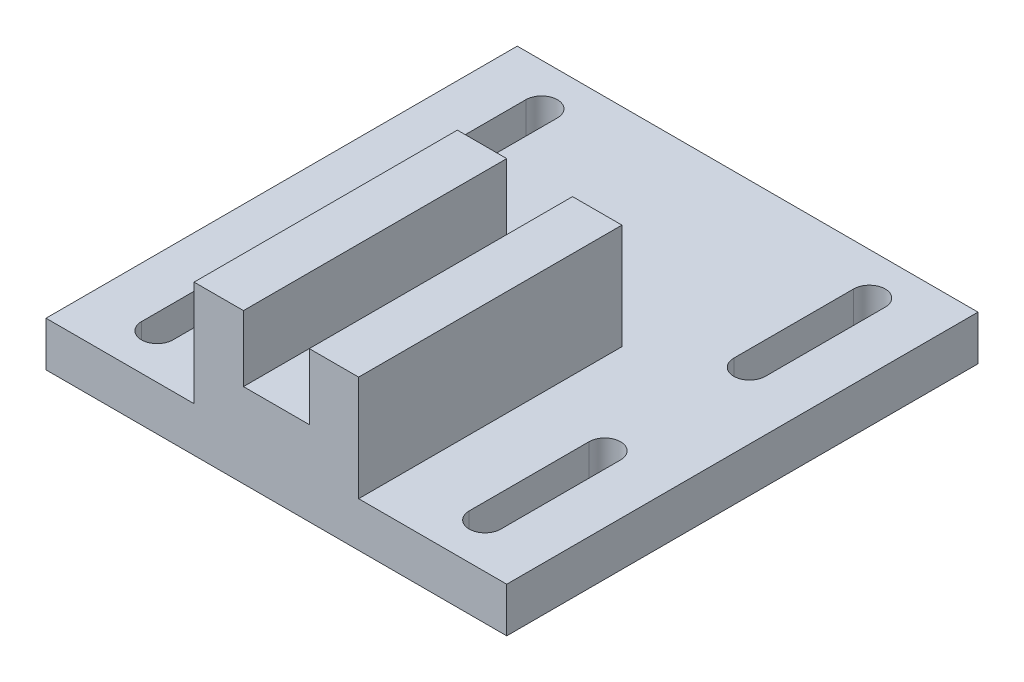
ISO-10303-21;
HEADER;
FILE_DESCRIPTION(('STEP AP214'),'2;1');
FILE_NAME('part.step','',(''),(''),'','','');
FILE_SCHEMA(('AUTOMOTIVE_DESIGN { 1 0 10303 214 1 1 1 1 }'));
ENDSEC;
DATA;
#1=APPLICATION_CONTEXT('core data for automotive mechanical design processes');
#2=APPLICATION_PROTOCOL_DEFINITION('international standard','automotive_design',2000,#1);
#3=PRODUCT_CONTEXT('',#1,'mechanical');
#4=PRODUCT('Part','Part','',(#3));
#5=PRODUCT_RELATED_PRODUCT_CATEGORY('part','',(#4));
#6=PRODUCT_DEFINITION_FORMATION('','',#4);
#7=PRODUCT_DEFINITION_CONTEXT('part definition',#1,'design');
#8=PRODUCT_DEFINITION('design','',#6,#7);
#9=PRODUCT_DEFINITION_SHAPE('','',#8);
#10=(LENGTH_UNIT() NAMED_UNIT(*) SI_UNIT(.MILLI.,.METRE.));
#11=(NAMED_UNIT(*) PLANE_ANGLE_UNIT() SI_UNIT($,.RADIAN.));
#12=(NAMED_UNIT(*) SI_UNIT($,.STERADIAN.) SOLID_ANGLE_UNIT());
#13=UNCERTAINTY_MEASURE_WITH_UNIT(LENGTH_MEASURE(1.E-05),#10,'distance_accuracy_value','');
#14=(GEOMETRIC_REPRESENTATION_CONTEXT(3) GLOBAL_UNCERTAINTY_ASSIGNED_CONTEXT((#13)) GLOBAL_UNIT_ASSIGNED_CONTEXT((#10,
#11,#12)) REPRESENTATION_CONTEXT('',''));
#15=CARTESIAN_POINT('',(0.,0.,0.));
#16=DIRECTION('',(0.,0.,1.));
#17=DIRECTION('',(1.,0.,0.));
#18=AXIS2_PLACEMENT_3D('',#15,#16,#17);
#19=CARTESIAN_POINT('',(0.,14.478,0.));
#20=DIRECTION('',(0.,1.,0.));
#21=DIRECTION('',(0.,0.,1.));
#22=AXIS2_PLACEMENT_3D('',#19,#20,#21);
#23=PLANE('',#22);
#24=DIRECTION('',(0.,0.,-1.));
#25=VECTOR('',#24,1.);
#26=CARTESIAN_POINT('',(25.4,14.478,0.));
#27=LINE('',#26,#25);
#28=CARTESIAN_POINT('',(25.4,14.478,45.466));
#29=VERTEX_POINT('',#28);
#30=CARTESIAN_POINT('',(25.4,14.478,20.066));
#31=VERTEX_POINT('',#30);
#32=EDGE_CURVE('E47',#29,#31,#27,.T.);
#33=ORIENTED_EDGE('',*,*,#32,.F.);
#34=DIRECTION('',(-1.,0.,0.));
#35=VECTOR('',#34,1.);
#36=CARTESIAN_POINT('',(0.,14.478,45.466));
#37=LINE('',#36,#35);
#38=CARTESIAN_POINT('',(30.1625,14.478,45.466));
#39=VERTEX_POINT('',#38);
#40=EDGE_CURVE('E258',#39,#29,#37,.T.);
#41=ORIENTED_EDGE('',*,*,#40,.F.);
#42=DIRECTION('',(0.,0.,1.));
#43=VECTOR('',#42,1.);
#44=CARTESIAN_POINT('',(30.1625,14.478,0.));
#45=LINE('',#44,#43);
#46=CARTESIAN_POINT('',(30.1625,14.478,20.066));
#47=VERTEX_POINT('',#46);
#48=EDGE_CURVE('E261',#47,#39,#45,.T.);
#49=ORIENTED_EDGE('',*,*,#48,.F.);
#50=DIRECTION('',(-1.,0.,0.));
#51=VECTOR('',#50,1.);
#52=CARTESIAN_POINT('',(0.,14.478,20.066));
#53=LINE('',#52,#51);
#54=EDGE_CURVE('E251',#47,#31,#53,.T.);
#55=ORIENTED_EDGE('',*,*,#54,.T.);
#56=EDGE_LOOP('',(#33,#41,#49,#55));
#57=FACE_BOUND('',#56,.T.);
#58=ADVANCED_FACE('F39',(#57),#23,.T.);
#59=CARTESIAN_POINT('',(0.,4.318,0.));
#60=DIRECTION('',(0.,1.,0.));
#61=DIRECTION('',(0.,0.,1.));
#62=AXIS2_PLACEMENT_3D('',#59,#60,#61);
#63=PLANE('',#62);
#64=CARTESIAN_POINT('',(38.0365,4.318,41.148));
#65=DIRECTION('',(0.,1.,0.));
#66=DIRECTION('',(0.,0.,1.));
#67=AXIS2_PLACEMENT_3D('',#64,#65,#66);
#68=CIRCLE('',#67,1.524);
#69=CARTESIAN_POINT('',(36.5125,4.318,41.148));
#70=VERTEX_POINT('',#69);
#71=CARTESIAN_POINT('',(39.5605,4.318,41.148));
#72=VERTEX_POINT('',#71);
#73=EDGE_CURVE('E282',#70,#72,#68,.T.);
#74=ORIENTED_EDGE('',*,*,#73,.F.);
#75=DIRECTION('',(0.,0.,1.));
#76=VECTOR('',#75,1.);
#77=CARTESIAN_POINT('',(36.5125,4.318,0.));
#78=LINE('',#77,#76);
#79=CARTESIAN_POINT('',(36.5125,4.318,29.591));
#80=VERTEX_POINT('',#79);
#81=EDGE_CURVE('E285',#80,#70,#78,.T.);
#82=ORIENTED_EDGE('',*,*,#81,.F.);
#83=CARTESIAN_POINT('',(38.0365,4.318,29.591));
#84=DIRECTION('',(0.,1.,0.));
#85=DIRECTION('',(0.,0.,1.));
#86=AXIS2_PLACEMENT_3D('',#83,#84,#85);
#87=CIRCLE('',#86,1.524);
#88=CARTESIAN_POINT('',(39.5605,4.318,29.591));
#89=VERTEX_POINT('',#88);
#90=EDGE_CURVE('E289',#89,#80,#87,.T.);
#91=ORIENTED_EDGE('',*,*,#90,.F.);
#92=DIRECTION('',(0.,0.,1.));
#93=VECTOR('',#92,1.);
#94=CARTESIAN_POINT('',(39.5605,4.318,0.));
#95=LINE('',#94,#93);
#96=EDGE_CURVE('E292',#89,#72,#95,.T.);
#97=ORIENTED_EDGE('',*,*,#96,.T.);
#98=EDGE_LOOP('',(#74,#82,#91,#97));
#99=FACE_BOUND('',#98,.T.);
#100=CARTESIAN_POINT('',(38.0365,4.318,15.621));
#101=DIRECTION('',(0.,1.,0.));
#102=DIRECTION('',(0.,0.,1.));
#103=AXIS2_PLACEMENT_3D('',#100,#101,#102);
#104=CIRCLE('',#103,1.52400000000002);
#105=CARTESIAN_POINT('',(36.5125,4.318,15.621));
#106=VERTEX_POINT('',#105);
#107=CARTESIAN_POINT('',(39.5605,4.318,15.621));
#108=VERTEX_POINT('',#107);
#109=EDGE_CURVE('E294',#106,#108,#104,.T.);
#110=ORIENTED_EDGE('',*,*,#109,.F.);
#111=DIRECTION('',(0.,0.,1.));
#112=VECTOR('',#111,1.);
#113=CARTESIAN_POINT('',(36.5125,4.318,0.));
#114=LINE('',#113,#112);
#115=CARTESIAN_POINT('',(36.5125,4.318,4.064));
#116=VERTEX_POINT('',#115);
#117=EDGE_CURVE('E297',#116,#106,#114,.T.);
#118=ORIENTED_EDGE('',*,*,#117,.F.);
#119=CARTESIAN_POINT('',(38.0365,4.318,4.064));
#120=DIRECTION('',(0.,1.,0.));
#121=DIRECTION('',(0.,0.,1.));
#122=AXIS2_PLACEMENT_3D('',#119,#120,#121);
#123=CIRCLE('',#122,1.52400000000001);
#124=CARTESIAN_POINT('',(39.5605,4.318,4.064));
#125=VERTEX_POINT('',#124);
#126=EDGE_CURVE('E300',#125,#116,#123,.T.);
#127=ORIENTED_EDGE('',*,*,#126,.F.);
#128=DIRECTION('',(0.,0.,1.));
#129=VECTOR('',#128,1.);
#130=CARTESIAN_POINT('',(39.5605,4.318,0.));
#131=LINE('',#130,#129);
#132=EDGE_CURVE('E303',#125,#108,#131,.T.);
#133=ORIENTED_EDGE('',*,*,#132,.T.);
#134=EDGE_LOOP('',(#110,#118,#127,#133));
#135=FACE_BOUND('',#134,.T.);
#136=CARTESIAN_POINT('',(6.4135,4.318,41.148));
#137=DIRECTION('',(0.,1.,0.));
#138=DIRECTION('',(0.,0.,1.));
#139=AXIS2_PLACEMENT_3D('',#136,#137,#138);
#140=CIRCLE('',#139,1.524);
#141=CARTESIAN_POINT('',(4.88949999999999,4.318,41.148));
#142=VERTEX_POINT('',#141);
#143=CARTESIAN_POINT('',(7.9375,4.318,41.148));
#144=VERTEX_POINT('',#143);
#145=EDGE_CURVE('E305',#142,#144,#140,.T.);
#146=ORIENTED_EDGE('',*,*,#145,.F.);
#147=DIRECTION('',(0.,0.,1.));
#148=VECTOR('',#147,1.);
#149=CARTESIAN_POINT('',(4.88949999999999,4.318,0.));
#150=LINE('',#149,#148);
#151=CARTESIAN_POINT('',(4.88949999999999,4.318,29.591));
#152=VERTEX_POINT('',#151);
#153=EDGE_CURVE('E308',#152,#142,#150,.T.);
#154=ORIENTED_EDGE('',*,*,#153,.F.);
#155=CARTESIAN_POINT('',(6.4135,4.318,29.591));
#156=DIRECTION('',(0.,1.,0.));
#157=DIRECTION('',(0.,0.,1.));
#158=AXIS2_PLACEMENT_3D('',#155,#156,#157);
#159=CIRCLE('',#158,1.524);
#160=CARTESIAN_POINT('',(7.9375,4.318,29.591));
#161=VERTEX_POINT('',#160);
#162=EDGE_CURVE('E311',#161,#152,#159,.T.);
#163=ORIENTED_EDGE('',*,*,#162,.F.);
#164=DIRECTION('',(0.,0.,1.));
#165=VECTOR('',#164,1.);
#166=CARTESIAN_POINT('',(7.9375,4.318,0.));
#167=LINE('',#166,#165);
#168=EDGE_CURVE('E314',#161,#144,#167,.T.);
#169=ORIENTED_EDGE('',*,*,#168,.T.);
#170=EDGE_LOOP('',(#146,#154,#163,#169));
#171=FACE_BOUND('',#170,.T.);
#172=CARTESIAN_POINT('',(6.4135,4.318,15.621));
#173=DIRECTION('',(0.,1.,0.));
#174=DIRECTION('',(0.,0.,1.));
#175=AXIS2_PLACEMENT_3D('',#172,#173,#174);
#176=CIRCLE('',#175,1.52400000000002);
#177=CARTESIAN_POINT('',(4.88949999999998,4.318,15.621));
#178=VERTEX_POINT('',#177);
#179=CARTESIAN_POINT('',(7.93750000000002,4.318,15.621));
#180=VERTEX_POINT('',#179);
#181=EDGE_CURVE('E316',#178,#180,#176,.T.);
#182=ORIENTED_EDGE('',*,*,#181,.F.);
#183=DIRECTION('',(0.,0.,1.));
#184=VECTOR('',#183,1.);
#185=CARTESIAN_POINT('',(4.88949999999999,4.318,0.));
#186=LINE('',#185,#184);
#187=CARTESIAN_POINT('',(4.88949999999998,4.318,4.064));
#188=VERTEX_POINT('',#187);
#189=EDGE_CURVE('E319',#188,#178,#186,.T.);
#190=ORIENTED_EDGE('',*,*,#189,.F.);
#191=CARTESIAN_POINT('',(6.4135,4.318,4.064));
#192=DIRECTION('',(0.,1.,0.));
#193=DIRECTION('',(0.,0.,1.));
#194=AXIS2_PLACEMENT_3D('',#191,#192,#193);
#195=CIRCLE('',#194,1.52400000000001);
#196=CARTESIAN_POINT('',(7.93750000000001,4.318,4.064));
#197=VERTEX_POINT('',#196);
#198=EDGE_CURVE('E322',#197,#188,#195,.T.);
#199=ORIENTED_EDGE('',*,*,#198,.F.);
#200=DIRECTION('',(0.,0.,1.));
#201=VECTOR('',#200,1.);
#202=CARTESIAN_POINT('',(7.9375,4.318,0.));
#203=LINE('',#202,#201);
#204=EDGE_CURVE('E325',#197,#180,#203,.T.);
#205=ORIENTED_EDGE('',*,*,#204,.T.);
#206=EDGE_LOOP('',(#182,#190,#199,#205));
#207=FACE_BOUND('',#206,.T.);
#208=DIRECTION('',(-1.,0.,0.));
#209=VECTOR('',#208,1.);
#210=CARTESIAN_POINT('',(0.,4.318,20.066));
#211=LINE('',#210,#209);
#212=CARTESIAN_POINT('',(30.1625,4.318,20.066));
#213=VERTEX_POINT('',#212);
#214=CARTESIAN_POINT('',(14.2875,4.318,20.066));
#215=VERTEX_POINT('',#214);
#216=EDGE_CURVE('E62',#213,#215,#211,.T.);
#217=ORIENTED_EDGE('',*,*,#216,.F.);
#218=DIRECTION('',(0.,0.,1.));
#219=VECTOR('',#218,1.);
#220=CARTESIAN_POINT('',(30.1625,4.318,0.));
#221=LINE('',#220,#219);
#222=CARTESIAN_POINT('',(30.1625,4.318,45.466));
#223=VERTEX_POINT('',#222);
#224=EDGE_CURVE('E269',#213,#223,#221,.T.);
#225=ORIENTED_EDGE('',*,*,#224,.T.);
#226=DIRECTION('',(1.,0.,0.));
#227=VECTOR('',#226,1.);
#228=CARTESIAN_POINT('',(0.,4.318,45.466));
#229=LINE('',#228,#227);
#230=CARTESIAN_POINT('',(44.45,4.318,45.466));
#231=VERTEX_POINT('',#230);
#232=EDGE_CURVE('E330',#223,#231,#229,.T.);
#233=ORIENTED_EDGE('',*,*,#232,.T.);
#234=DIRECTION('',(0.,0.,1.));
#235=VECTOR('',#234,1.);
#236=CARTESIAN_POINT('',(44.45,4.318,0.));
#237=LINE('',#236,#235);
#238=CARTESIAN_POINT('',(44.45,4.318,0.));
#239=VERTEX_POINT('',#238);
#240=EDGE_CURVE('E333',#239,#231,#237,.T.);
#241=ORIENTED_EDGE('',*,*,#240,.F.);
#242=DIRECTION('',(1.,0.,0.));
#243=VECTOR('',#242,1.);
#244=CARTESIAN_POINT('',(0.,4.318,0.));
#245=LINE('',#244,#243);
#246=CARTESIAN_POINT('',(0.,4.318,0.));
#247=VERTEX_POINT('',#246);
#248=EDGE_CURVE('E336',#247,#239,#245,.T.);
#249=ORIENTED_EDGE('',*,*,#248,.F.);
#250=DIRECTION('',(0.,0.,1.));
#251=VECTOR('',#250,1.);
#252=CARTESIAN_POINT('',(0.,4.318,0.));
#253=LINE('',#252,#251);
#254=CARTESIAN_POINT('',(0.,4.318,45.466));
#255=VERTEX_POINT('',#254);
#256=EDGE_CURVE('E327',#247,#255,#253,.T.);
#257=ORIENTED_EDGE('',*,*,#256,.T.);
#258=CARTESIAN_POINT('',(14.2875,4.318,45.466));
#259=VERTEX_POINT('',#258);
#260=EDGE_CURVE('E331',#255,#259,#229,.T.);
#261=ORIENTED_EDGE('',*,*,#260,.T.);
#262=DIRECTION('',(0.,0.,1.));
#263=VECTOR('',#262,1.);
#264=CARTESIAN_POINT('',(14.2875,4.318,0.));
#265=LINE('',#264,#263);
#266=EDGE_CURVE('E266',#215,#259,#265,.T.);
#267=ORIENTED_EDGE('',*,*,#266,.F.);
#268=EDGE_LOOP('',(#217,#225,#233,#241,#249,#257,#261,#267));
#269=FACE_BOUND('',#268,.T.);
#270=ADVANCED_FACE('F461',(#99,#135,#171,#207,#269),#63,.T.);
#271=CARTESIAN_POINT('',(0.,4.318,0.));
#272=DIRECTION('',(1.,0.,0.));
#273=DIRECTION('',(0.,0.,-1.));
#274=AXIS2_PLACEMENT_3D('',#271,#272,#273);
#275=PLANE('',#274);
#276=DIRECTION('',(0.,0.,1.));
#277=VECTOR('',#276,1.);
#278=CARTESIAN_POINT('',(0.,0.,0.));
#279=LINE('',#278,#277);
#280=CARTESIAN_POINT('',(0.,0.,0.));
#281=VERTEX_POINT('',#280);
#282=CARTESIAN_POINT('',(0.,0.,45.466));
#283=VERTEX_POINT('',#282);
#284=EDGE_CURVE('E387',#281,#283,#279,.T.);
#285=ORIENTED_EDGE('',*,*,#284,.T.);
#286=DIRECTION('',(0.,-1.,0.));
#287=VECTOR('',#286,1.);
#288=CARTESIAN_POINT('',(0.,4.318,45.466));
#289=LINE('',#288,#287);
#290=EDGE_CURVE('E405',#255,#283,#289,.T.);
#291=ORIENTED_EDGE('',*,*,#290,.F.);
#292=ORIENTED_EDGE('',*,*,#256,.F.);
#293=DIRECTION('',(0.,-1.,0.));
#294=VECTOR('',#293,1.);
#295=CARTESIAN_POINT('',(0.,4.318,0.));
#296=LINE('',#295,#294);
#297=EDGE_CURVE('E398',#247,#281,#296,.T.);
#298=ORIENTED_EDGE('',*,*,#297,.T.);
#299=EDGE_LOOP('',(#285,#291,#292,#298));
#300=FACE_BOUND('',#299,.T.);
#301=ADVANCED_FACE('F472',(#300),#275,.F.);
#302=CARTESIAN_POINT('',(0.,4.318,45.466));
#303=DIRECTION('',(0.,0.,-1.));
#304=DIRECTION('',(-1.,0.,0.));
#305=AXIS2_PLACEMENT_3D('',#302,#303,#304);
#306=PLANE('',#305);
#307=ORIENTED_EDGE('',*,*,#40,.T.);
#308=DIRECTION('',(0.,-1.,0.));
#309=VECTOR('',#308,1.);
#310=CARTESIAN_POINT('',(25.4,4.318,45.466));
#311=LINE('',#310,#309);
#312=CARTESIAN_POINT('',(25.4,8.128,45.466));
#313=VERTEX_POINT('',#312);
#314=EDGE_CURVE('E246',#29,#313,#311,.T.);
#315=ORIENTED_EDGE('',*,*,#314,.T.);
#316=DIRECTION('',(-1.,0.,0.));
#317=VECTOR('',#316,1.);
#318=CARTESIAN_POINT('',(0.,8.128,45.466));
#319=LINE('',#318,#317);
#320=CARTESIAN_POINT('',(19.05,8.128,45.466));
#321=VERTEX_POINT('',#320);
#322=EDGE_CURVE('E249',#313,#321,#319,.T.);
#323=ORIENTED_EDGE('',*,*,#322,.T.);
#324=DIRECTION('',(0.,1.,0.));
#325=VECTOR('',#324,1.);
#326=CARTESIAN_POINT('',(19.05,4.318,45.466));
#327=LINE('',#326,#325);
#328=CARTESIAN_POINT('',(19.05,14.478,45.466));
#329=VERTEX_POINT('',#328);
#330=EDGE_CURVE('E234',#321,#329,#327,.T.);
#331=ORIENTED_EDGE('',*,*,#330,.T.);
#332=CARTESIAN_POINT('',(14.2875,14.478,45.466));
#333=VERTEX_POINT('',#332);
#334=EDGE_CURVE('E257',#329,#333,#37,.T.);
#335=ORIENTED_EDGE('',*,*,#334,.T.);
#336=DIRECTION('',(0.,-1.,0.));
#337=VECTOR('',#336,1.);
#338=CARTESIAN_POINT('',(14.2875,14.478,45.466));
#339=LINE('',#338,#337);
#340=EDGE_CURVE('E275',#333,#259,#339,.T.);
#341=ORIENTED_EDGE('',*,*,#340,.T.);
#342=ORIENTED_EDGE('',*,*,#260,.F.);
#343=ORIENTED_EDGE('',*,*,#290,.T.);
#344=DIRECTION('',(1.,0.,0.));
#345=VECTOR('',#344,1.);
#346=CARTESIAN_POINT('',(0.,0.,45.466));
#347=LINE('',#346,#345);
#348=CARTESIAN_POINT('',(44.45,0.,45.466));
#349=VERTEX_POINT('',#348);
#350=EDGE_CURVE('E390',#283,#349,#347,.T.);
#351=ORIENTED_EDGE('',*,*,#350,.T.);
#352=DIRECTION('',(0.,-1.,0.));
#353=VECTOR('',#352,1.);
#354=CARTESIAN_POINT('',(44.45,4.318,45.466));
#355=LINE('',#354,#353);
#356=EDGE_CURVE('E403',#231,#349,#355,.T.);
#357=ORIENTED_EDGE('',*,*,#356,.F.);
#358=ORIENTED_EDGE('',*,*,#232,.F.);
#359=DIRECTION('',(0.,-1.,0.));
#360=VECTOR('',#359,1.);
#361=CARTESIAN_POINT('',(30.1625,14.478,45.466));
#362=LINE('',#361,#360);
#363=EDGE_CURVE('E272',#39,#223,#362,.T.);
#364=ORIENTED_EDGE('',*,*,#363,.F.);
#365=EDGE_LOOP('',(#307,#315,#323,#331,#335,#341,#342,#343,#351,#357,#358,#364));
#366=FACE_BOUND('',#365,.T.);
#367=ADVANCED_FACE('F457',(#366),#306,.F.);
#368=CARTESIAN_POINT('',(44.45,4.318,0.));
#369=DIRECTION('',(1.,0.,0.));
#370=DIRECTION('',(0.,0.,-1.));
#371=AXIS2_PLACEMENT_3D('',#368,#369,#370);
#372=PLANE('',#371);
#373=DIRECTION('',(0.,0.,1.));
#374=VECTOR('',#373,1.);
#375=CARTESIAN_POINT('',(44.45,0.,0.));
#376=LINE('',#375,#374);
#377=CARTESIAN_POINT('',(44.45,0.,0.));
#378=VERTEX_POINT('',#377);
#379=EDGE_CURVE('E393',#378,#349,#376,.T.);
#380=ORIENTED_EDGE('',*,*,#379,.F.);
#381=DIRECTION('',(0.,-1.,0.));
#382=VECTOR('',#381,1.);
#383=CARTESIAN_POINT('',(44.45,4.318,0.));
#384=LINE('',#383,#382);
#385=EDGE_CURVE('E400',#239,#378,#384,.T.);
#386=ORIENTED_EDGE('',*,*,#385,.F.);
#387=ORIENTED_EDGE('',*,*,#240,.T.);
#388=ORIENTED_EDGE('',*,*,#356,.T.);
#389=EDGE_LOOP('',(#380,#386,#387,#388));
#390=FACE_BOUND('',#389,.T.);
#391=ADVANCED_FACE('F475',(#390),#372,.T.);
#392=CARTESIAN_POINT('',(6.4135,4.318,15.621));
#393=DIRECTION('',(0.,-1.,0.));
#394=DIRECTION('',(0.,0.,-1.));
#395=AXIS2_PLACEMENT_3D('',#392,#393,#394);
#396=CYLINDRICAL_SURFACE('',#395,1.52400000000002);
#397=CARTESIAN_POINT('',(6.4135,0.,15.621));
#398=DIRECTION('',(0.,1.,0.));
#399=DIRECTION('',(0.,0.,1.));
#400=AXIS2_PLACEMENT_3D('',#397,#398,#399);
#401=CIRCLE('',#400,1.52400000000002);
#402=CARTESIAN_POINT('',(4.88949999999998,0.,15.621));
#403=VERTEX_POINT('',#402);
#404=CARTESIAN_POINT('',(7.93750000000002,0.,15.621));
#405=VERTEX_POINT('',#404);
#406=EDGE_CURVE('E375',#403,#405,#401,.T.);
#407=ORIENTED_EDGE('',*,*,#406,.F.);
#408=DIRECTION('',(0.,-1.,0.));
#409=VECTOR('',#408,1.);
#410=CARTESIAN_POINT('',(4.88949999999998,4.318,15.621));
#411=LINE('',#410,#409);
#412=EDGE_CURVE('E401',#178,#403,#411,.T.);
#413=ORIENTED_EDGE('',*,*,#412,.F.);
#414=ORIENTED_EDGE('',*,*,#181,.T.);
#415=DIRECTION('',(0.,-1.,0.));
#416=VECTOR('',#415,1.);
#417=CARTESIAN_POINT('',(7.93750000000002,4.318,15.621));
#418=LINE('',#417,#416);
#419=EDGE_CURVE('E409',#180,#405,#418,.T.);
#420=ORIENTED_EDGE('',*,*,#419,.T.);
#421=EDGE_LOOP('',(#407,#413,#414,#420));
#422=FACE_BOUND('',#421,.T.);
#423=ADVANCED_FACE('F477',(#422),#396,.F.);
#424=CARTESIAN_POINT('',(4.88949999999999,4.318,0.));
#425=DIRECTION('',(1.,0.,0.));
#426=DIRECTION('',(0.,0.,-1.));
#427=AXIS2_PLACEMENT_3D('',#424,#425,#426);
#428=PLANE('',#427);
#429=DIRECTION('',(0.,0.,1.));
#430=VECTOR('',#429,1.);
#431=CARTESIAN_POINT('',(4.88949999999999,0.,0.));
#432=LINE('',#431,#430);
#433=CARTESIAN_POINT('',(4.88949999999998,0.,4.064));
#434=VERTEX_POINT('',#433);
#435=EDGE_CURVE('E378',#434,#403,#432,.T.);
#436=ORIENTED_EDGE('',*,*,#435,.F.);
#437=DIRECTION('',(0.,-1.,0.));
#438=VECTOR('',#437,1.);
#439=CARTESIAN_POINT('',(4.88949999999998,4.318,4.064));
#440=LINE('',#439,#438);
#441=EDGE_CURVE('E414',#188,#434,#440,.T.);
#442=ORIENTED_EDGE('',*,*,#441,.F.);
#443=ORIENTED_EDGE('',*,*,#189,.T.);
#444=ORIENTED_EDGE('',*,*,#412,.T.);
#445=EDGE_LOOP('',(#436,#442,#443,#444));
#446=FACE_BOUND('',#445,.T.);
#447=ADVANCED_FACE('F483',(#446),#428,.T.);
#448=CARTESIAN_POINT('',(6.4135,4.318,4.064));
#449=DIRECTION('',(0.,-1.,0.));
#450=DIRECTION('',(0.,0.,-1.));
#451=AXIS2_PLACEMENT_3D('',#448,#449,#450);
#452=CYLINDRICAL_SURFACE('',#451,1.52400000000001);
#453=CARTESIAN_POINT('',(6.4135,0.,4.064));
#454=DIRECTION('',(0.,1.,0.));
#455=DIRECTION('',(0.,0.,1.));
#456=AXIS2_PLACEMENT_3D('',#453,#454,#455);
#457=CIRCLE('',#456,1.52400000000001);
#458=CARTESIAN_POINT('',(7.93750000000001,0.,4.064));
#459=VERTEX_POINT('',#458);
#460=EDGE_CURVE('E381',#459,#434,#457,.T.);
#461=ORIENTED_EDGE('',*,*,#460,.F.);
#462=DIRECTION('',(0.,-1.,0.));
#463=VECTOR('',#462,1.);
#464=CARTESIAN_POINT('',(7.93750000000001,4.318,4.064));
#465=LINE('',#464,#463);
#466=EDGE_CURVE('E411',#197,#459,#465,.T.);
#467=ORIENTED_EDGE('',*,*,#466,.F.);
#468=ORIENTED_EDGE('',*,*,#198,.T.);
#469=ORIENTED_EDGE('',*,*,#441,.T.);
#470=EDGE_LOOP('',(#461,#467,#468,#469));
#471=FACE_BOUND('',#470,.T.);
#472=ADVANCED_FACE('F569',(#471),#452,.F.);
#473=CARTESIAN_POINT('',(6.4135,4.318,41.148));
#474=DIRECTION('',(0.,-1.,0.));
#475=DIRECTION('',(0.,0.,-1.));
#476=AXIS2_PLACEMENT_3D('',#473,#474,#475);
#477=CYLINDRICAL_SURFACE('',#476,1.524);
#478=CARTESIAN_POINT('',(6.4135,0.,41.148));
#479=DIRECTION('',(0.,1.,0.));
#480=DIRECTION('',(0.,0.,1.));
#481=AXIS2_PLACEMENT_3D('',#478,#479,#480);
#482=CIRCLE('',#481,1.524);
#483=CARTESIAN_POINT('',(4.88949999999999,0.,41.148));
#484=VERTEX_POINT('',#483);
#485=CARTESIAN_POINT('',(7.9375,0.,41.148));
#486=VERTEX_POINT('',#485);
#487=EDGE_CURVE('E363',#484,#486,#482,.T.);
#488=ORIENTED_EDGE('',*,*,#487,.F.);
#489=DIRECTION('',(0.,-1.,0.));
#490=VECTOR('',#489,1.);
#491=CARTESIAN_POINT('',(4.88949999999999,4.318,41.148));
#492=LINE('',#491,#490);
#493=EDGE_CURVE('E412',#142,#484,#492,.T.);
#494=ORIENTED_EDGE('',*,*,#493,.F.);
#495=ORIENTED_EDGE('',*,*,#145,.T.);
#496=DIRECTION('',(0.,-1.,0.));
#497=VECTOR('',#496,1.);
#498=CARTESIAN_POINT('',(7.9375,4.318,41.148));
#499=LINE('',#498,#497);
#500=EDGE_CURVE('E417',#144,#486,#499,.T.);
#501=ORIENTED_EDGE('',*,*,#500,.T.);
#502=EDGE_LOOP('',(#488,#494,#495,#501));
#503=FACE_BOUND('',#502,.T.);
#504=ADVANCED_FACE('F584',(#503),#477,.F.);
#505=CARTESIAN_POINT('',(4.88949999999999,4.318,0.));
#506=DIRECTION('',(1.,0.,0.));
#507=DIRECTION('',(0.,0.,-1.));
#508=AXIS2_PLACEMENT_3D('',#505,#506,#507);
#509=PLANE('',#508);
#510=DIRECTION('',(0.,0.,1.));
#511=VECTOR('',#510,1.);
#512=CARTESIAN_POINT('',(4.88949999999999,0.,0.));
#513=LINE('',#512,#511);
#514=CARTESIAN_POINT('',(4.88949999999999,0.,29.591));
#515=VERTEX_POINT('',#514);
#516=EDGE_CURVE('E366',#515,#484,#513,.T.);
#517=ORIENTED_EDGE('',*,*,#516,.F.);
#518=DIRECTION('',(0.,-1.,0.));
#519=VECTOR('',#518,1.);
#520=CARTESIAN_POINT('',(4.88949999999999,4.318,29.591));
#521=LINE('',#520,#519);
#522=EDGE_CURVE('E422',#152,#515,#521,.T.);
#523=ORIENTED_EDGE('',*,*,#522,.F.);
#524=ORIENTED_EDGE('',*,*,#153,.T.);
#525=ORIENTED_EDGE('',*,*,#493,.T.);
#526=EDGE_LOOP('',(#517,#523,#524,#525));
#527=FACE_BOUND('',#526,.T.);
#528=ADVANCED_FACE('F590',(#527),#509,.T.);
#529=CARTESIAN_POINT('',(6.4135,4.318,29.591));
#530=DIRECTION('',(0.,-1.,0.));
#531=DIRECTION('',(0.,0.,-1.));
#532=AXIS2_PLACEMENT_3D('',#529,#530,#531);
#533=CYLINDRICAL_SURFACE('',#532,1.524);
#534=CARTESIAN_POINT('',(6.4135,0.,29.591));
#535=DIRECTION('',(0.,1.,0.));
#536=DIRECTION('',(0.,0.,1.));
#537=AXIS2_PLACEMENT_3D('',#534,#535,#536);
#538=CIRCLE('',#537,1.524);
#539=CARTESIAN_POINT('',(7.9375,0.,29.591));
#540=VERTEX_POINT('',#539);
#541=EDGE_CURVE('E369',#540,#515,#538,.T.);
#542=ORIENTED_EDGE('',*,*,#541,.F.);
#543=DIRECTION('',(0.,-1.,0.));
#544=VECTOR('',#543,1.);
#545=CARTESIAN_POINT('',(7.9375,4.318,29.591));
#546=LINE('',#545,#544);
#547=EDGE_CURVE('E419',#161,#540,#546,.T.);
#548=ORIENTED_EDGE('',*,*,#547,.F.);
#549=ORIENTED_EDGE('',*,*,#162,.T.);
#550=ORIENTED_EDGE('',*,*,#522,.T.);
#551=EDGE_LOOP('',(#542,#548,#549,#550));
#552=FACE_BOUND('',#551,.T.);
#553=ADVANCED_FACE('F587',(#552),#533,.F.);
#554=CARTESIAN_POINT('',(38.0365,4.318,15.621));
#555=DIRECTION('',(0.,-1.,0.));
#556=DIRECTION('',(0.,0.,-1.));
#557=AXIS2_PLACEMENT_3D('',#554,#555,#556);
#558=CYLINDRICAL_SURFACE('',#557,1.52400000000002);
#559=CARTESIAN_POINT('',(38.0365,0.,15.621));
#560=DIRECTION('',(0.,1.,0.));
#561=DIRECTION('',(0.,0.,1.));
#562=AXIS2_PLACEMENT_3D('',#559,#560,#561);
#563=CIRCLE('',#562,1.52400000000002);
#564=CARTESIAN_POINT('',(36.5125,0.,15.621));
#565=VERTEX_POINT('',#564);
#566=CARTESIAN_POINT('',(39.5605,0.,15.621));
#567=VERTEX_POINT('',#566);
#568=EDGE_CURVE('E351',#565,#567,#563,.T.);
#569=ORIENTED_EDGE('',*,*,#568,.F.);
#570=DIRECTION('',(0.,-1.,0.));
#571=VECTOR('',#570,1.);
#572=CARTESIAN_POINT('',(36.5125,4.318,15.621));
#573=LINE('',#572,#571);
#574=EDGE_CURVE('E420',#106,#565,#573,.T.);
#575=ORIENTED_EDGE('',*,*,#574,.F.);
#576=ORIENTED_EDGE('',*,*,#109,.T.);
#577=DIRECTION('',(0.,-1.,0.));
#578=VECTOR('',#577,1.);
#579=CARTESIAN_POINT('',(39.5605,4.318,15.621));
#580=LINE('',#579,#578);
#581=EDGE_CURVE('E425',#108,#567,#580,.T.);
#582=ORIENTED_EDGE('',*,*,#581,.T.);
#583=EDGE_LOOP('',(#569,#575,#576,#582));
#584=FACE_BOUND('',#583,.T.);
#585=ADVANCED_FACE('F528',(#584),#558,.F.);
#586=CARTESIAN_POINT('',(36.5125,4.318,0.));
#587=DIRECTION('',(1.,0.,0.));
#588=DIRECTION('',(0.,0.,-1.));
#589=AXIS2_PLACEMENT_3D('',#586,#587,#588);
#590=PLANE('',#589);
#591=DIRECTION('',(0.,0.,1.));
#592=VECTOR('',#591,1.);
#593=CARTESIAN_POINT('',(36.5125,0.,0.));
#594=LINE('',#593,#592);
#595=CARTESIAN_POINT('',(36.5125,0.,4.064));
#596=VERTEX_POINT('',#595);
#597=EDGE_CURVE('E354',#596,#565,#594,.T.);
#598=ORIENTED_EDGE('',*,*,#597,.F.);
#599=DIRECTION('',(0.,-1.,0.));
#600=VECTOR('',#599,1.);
#601=CARTESIAN_POINT('',(36.5125,4.318,4.064));
#602=LINE('',#601,#600);
#603=EDGE_CURVE('E430',#116,#596,#602,.T.);
#604=ORIENTED_EDGE('',*,*,#603,.F.);
#605=ORIENTED_EDGE('',*,*,#117,.T.);
#606=ORIENTED_EDGE('',*,*,#574,.T.);
#607=EDGE_LOOP('',(#598,#604,#605,#606));
#608=FACE_BOUND('',#607,.T.);
#609=ADVANCED_FACE('F599',(#608),#590,.T.);
#610=CARTESIAN_POINT('',(38.0365,4.318,4.064));
#611=DIRECTION('',(0.,-1.,0.));
#612=DIRECTION('',(0.,0.,-1.));
#613=AXIS2_PLACEMENT_3D('',#610,#611,#612);
#614=CYLINDRICAL_SURFACE('',#613,1.52400000000001);
#615=CARTESIAN_POINT('',(38.0365,0.,4.064));
#616=DIRECTION('',(0.,1.,0.));
#617=DIRECTION('',(0.,0.,1.));
#618=AXIS2_PLACEMENT_3D('',#615,#616,#617);
#619=CIRCLE('',#618,1.52400000000001);
#620=CARTESIAN_POINT('',(39.5605,0.,4.064));
#621=VERTEX_POINT('',#620);
#622=EDGE_CURVE('E357',#621,#596,#619,.T.);
#623=ORIENTED_EDGE('',*,*,#622,.F.);
#624=DIRECTION('',(0.,-1.,0.));
#625=VECTOR('',#624,1.);
#626=CARTESIAN_POINT('',(39.5605,4.318,4.064));
#627=LINE('',#626,#625);
#628=EDGE_CURVE('E427',#125,#621,#627,.T.);
#629=ORIENTED_EDGE('',*,*,#628,.F.);
#630=ORIENTED_EDGE('',*,*,#126,.T.);
#631=ORIENTED_EDGE('',*,*,#603,.T.);
#632=EDGE_LOOP('',(#623,#629,#630,#631));
#633=FACE_BOUND('',#632,.T.);
#634=ADVANCED_FACE('F540',(#633),#614,.F.);
#635=CARTESIAN_POINT('',(38.0365,4.318,41.148));
#636=DIRECTION('',(0.,-1.,0.));
#637=DIRECTION('',(0.,0.,-1.));
#638=AXIS2_PLACEMENT_3D('',#635,#636,#637);
#639=CYLINDRICAL_SURFACE('',#638,1.524);
#640=CARTESIAN_POINT('',(38.0365,0.,41.148));
#641=DIRECTION('',(0.,1.,0.));
#642=DIRECTION('',(0.,0.,1.));
#643=AXIS2_PLACEMENT_3D('',#640,#641,#642);
#644=CIRCLE('',#643,1.524);
#645=CARTESIAN_POINT('',(36.5125,0.,41.148));
#646=VERTEX_POINT('',#645);
#647=CARTESIAN_POINT('',(39.5605,0.,41.148));
#648=VERTEX_POINT('',#647);
#649=EDGE_CURVE('E281',#646,#648,#644,.T.);
#650=ORIENTED_EDGE('',*,*,#649,.F.);
#651=DIRECTION('',(0.,-1.,0.));
#652=VECTOR('',#651,1.);
#653=CARTESIAN_POINT('',(36.5125,4.318,41.148));
#654=LINE('',#653,#652);
#655=EDGE_CURVE('E428',#70,#646,#654,.T.);
#656=ORIENTED_EDGE('',*,*,#655,.F.);
#657=ORIENTED_EDGE('',*,*,#73,.T.);
#658=DIRECTION('',(0.,-1.,0.));
#659=VECTOR('',#658,1.);
#660=CARTESIAN_POINT('',(39.5605,4.318,41.148));
#661=LINE('',#660,#659);
#662=EDGE_CURVE('E339',#72,#648,#661,.T.);
#663=ORIENTED_EDGE('',*,*,#662,.T.);
#664=EDGE_LOOP('',(#650,#656,#657,#663));
#665=FACE_BOUND('',#664,.T.);
#666=ADVANCED_FACE('F41',(#665),#639,.F.);
#667=CARTESIAN_POINT('',(36.5125,4.318,0.));
#668=DIRECTION('',(1.,0.,0.));
#669=DIRECTION('',(0.,0.,-1.));
#670=AXIS2_PLACEMENT_3D('',#667,#668,#669);
#671=PLANE('',#670);
#672=DIRECTION('',(0.,0.,1.));
#673=VECTOR('',#672,1.);
#674=CARTESIAN_POINT('',(36.5125,0.,0.));
#675=LINE('',#674,#673);
#676=CARTESIAN_POINT('',(36.5125,0.,29.591));
#677=VERTEX_POINT('',#676);
#678=EDGE_CURVE('E342',#677,#646,#675,.T.);
#679=ORIENTED_EDGE('',*,*,#678,.F.);
#680=DIRECTION('',(0.,-1.,0.));
#681=VECTOR('',#680,1.);
#682=CARTESIAN_POINT('',(36.5125,4.318,29.591));
#683=LINE('',#682,#681);
#684=EDGE_CURVE('E436',#80,#677,#683,.T.);
#685=ORIENTED_EDGE('',*,*,#684,.F.);
#686=ORIENTED_EDGE('',*,*,#81,.T.);
#687=ORIENTED_EDGE('',*,*,#655,.T.);
#688=EDGE_LOOP('',(#679,#685,#686,#687));
#689=FACE_BOUND('',#688,.T.);
#690=ADVANCED_FACE('F533',(#689),#671,.T.);
#691=CARTESIAN_POINT('',(38.0365,4.318,29.591));
#692=DIRECTION('',(0.,-1.,0.));
#693=DIRECTION('',(0.,0.,-1.));
#694=AXIS2_PLACEMENT_3D('',#691,#692,#693);
#695=CYLINDRICAL_SURFACE('',#694,1.524);
#696=CARTESIAN_POINT('',(38.0365,0.,29.591));
#697=DIRECTION('',(0.,1.,0.));
#698=DIRECTION('',(0.,0.,1.));
#699=AXIS2_PLACEMENT_3D('',#696,#697,#698);
#700=CIRCLE('',#699,1.524);
#701=CARTESIAN_POINT('',(39.5605,0.,29.591));
#702=VERTEX_POINT('',#701);
#703=EDGE_CURVE('E345',#702,#677,#700,.T.);
#704=ORIENTED_EDGE('',*,*,#703,.F.);
#705=DIRECTION('',(0.,-1.,0.));
#706=VECTOR('',#705,1.);
#707=CARTESIAN_POINT('',(39.5605,4.318,29.591));
#708=LINE('',#707,#706);
#709=EDGE_CURVE('E434',#89,#702,#708,.T.);
#710=ORIENTED_EDGE('',*,*,#709,.F.);
#711=ORIENTED_EDGE('',*,*,#90,.T.);
#712=ORIENTED_EDGE('',*,*,#684,.T.);
#713=EDGE_LOOP('',(#704,#710,#711,#712));
#714=FACE_BOUND('',#713,.T.);
#715=ADVANCED_FACE('F530',(#714),#695,.F.);
#716=CARTESIAN_POINT('',(7.9375,4.318,0.));
#717=DIRECTION('',(1.,0.,0.));
#718=DIRECTION('',(0.,0.,-1.));
#719=AXIS2_PLACEMENT_3D('',#716,#717,#718);
#720=PLANE('',#719);
#721=DIRECTION('',(0.,0.,1.));
#722=VECTOR('',#721,1.);
#723=CARTESIAN_POINT('',(7.9375,0.,0.));
#724=LINE('',#723,#722);
#725=EDGE_CURVE('E384',#459,#405,#724,.T.);
#726=ORIENTED_EDGE('',*,*,#725,.T.);
#727=ORIENTED_EDGE('',*,*,#419,.F.);
#728=ORIENTED_EDGE('',*,*,#204,.F.);
#729=ORIENTED_EDGE('',*,*,#466,.T.);
#730=EDGE_LOOP('',(#726,#727,#728,#729));
#731=FACE_BOUND('',#730,.T.);
#732=ADVANCED_FACE('F532',(#731),#720,.F.);
#733=CARTESIAN_POINT('',(7.9375,4.318,0.));
#734=DIRECTION('',(1.,0.,0.));
#735=DIRECTION('',(0.,0.,-1.));
#736=AXIS2_PLACEMENT_3D('',#733,#734,#735);
#737=PLANE('',#736);
#738=DIRECTION('',(0.,0.,1.));
#739=VECTOR('',#738,1.);
#740=CARTESIAN_POINT('',(7.9375,0.,0.));
#741=LINE('',#740,#739);
#742=EDGE_CURVE('E372',#540,#486,#741,.T.);
#743=ORIENTED_EDGE('',*,*,#742,.T.);
#744=ORIENTED_EDGE('',*,*,#500,.F.);
#745=ORIENTED_EDGE('',*,*,#168,.F.);
#746=ORIENTED_EDGE('',*,*,#547,.T.);
#747=EDGE_LOOP('',(#743,#744,#745,#746));
#748=FACE_BOUND('',#747,.T.);
#749=ADVANCED_FACE('F523',(#748),#737,.F.);
#750=CARTESIAN_POINT('',(39.5605,4.318,0.));
#751=DIRECTION('',(1.,0.,0.));
#752=DIRECTION('',(0.,0.,-1.));
#753=AXIS2_PLACEMENT_3D('',#750,#751,#752);
#754=PLANE('',#753);
#755=DIRECTION('',(0.,0.,1.));
#756=VECTOR('',#755,1.);
#757=CARTESIAN_POINT('',(39.5605,0.,0.));
#758=LINE('',#757,#756);
#759=EDGE_CURVE('E360',#621,#567,#758,.T.);
#760=ORIENTED_EDGE('',*,*,#759,.T.);
#761=ORIENTED_EDGE('',*,*,#581,.F.);
#762=ORIENTED_EDGE('',*,*,#132,.F.);
#763=ORIENTED_EDGE('',*,*,#628,.T.);
#764=EDGE_LOOP('',(#760,#761,#762,#763));
#765=FACE_BOUND('',#764,.T.);
#766=ADVANCED_FACE('F517',(#765),#754,.F.);
#767=CARTESIAN_POINT('',(39.5605,4.318,0.));
#768=DIRECTION('',(1.,0.,0.));
#769=DIRECTION('',(0.,0.,-1.));
#770=AXIS2_PLACEMENT_3D('',#767,#768,#769);
#771=PLANE('',#770);
#772=DIRECTION('',(0.,0.,1.));
#773=VECTOR('',#772,1.);
#774=CARTESIAN_POINT('',(39.5605,0.,0.));
#775=LINE('',#774,#773);
#776=EDGE_CURVE('E348',#702,#648,#775,.T.);
#777=ORIENTED_EDGE('',*,*,#776,.T.);
#778=ORIENTED_EDGE('',*,*,#662,.F.);
#779=ORIENTED_EDGE('',*,*,#96,.F.);
#780=ORIENTED_EDGE('',*,*,#709,.T.);
#781=EDGE_LOOP('',(#777,#778,#779,#780));
#782=FACE_BOUND('',#781,.T.);
#783=ADVANCED_FACE('F513',(#782),#771,.F.);
#784=CARTESIAN_POINT('',(0.,4.318,0.));
#785=DIRECTION('',(0.,0.,-1.));
#786=DIRECTION('',(-1.,0.,0.));
#787=AXIS2_PLACEMENT_3D('',#784,#785,#786);
#788=PLANE('',#787);
#789=DIRECTION('',(1.,0.,0.));
#790=VECTOR('',#789,1.);
#791=CARTESIAN_POINT('',(0.,0.,0.));
#792=LINE('',#791,#790);
#793=EDGE_CURVE('E286',#281,#378,#792,.T.);
#794=ORIENTED_EDGE('',*,*,#793,.F.);
#795=ORIENTED_EDGE('',*,*,#297,.F.);
#796=ORIENTED_EDGE('',*,*,#248,.T.);
#797=ORIENTED_EDGE('',*,*,#385,.T.);
#798=EDGE_LOOP('',(#794,#795,#796,#797));
#799=FACE_BOUND('',#798,.T.);
#800=ADVANCED_FACE('F466',(#799),#788,.T.);
#801=CARTESIAN_POINT('',(0.,0.,0.));
#802=DIRECTION('',(0.,1.,0.));
#803=DIRECTION('',(0.,0.,1.));
#804=AXIS2_PLACEMENT_3D('',#801,#802,#803);
#805=PLANE('',#804);
#806=ORIENTED_EDGE('',*,*,#649,.T.);
#807=ORIENTED_EDGE('',*,*,#776,.F.);
#808=ORIENTED_EDGE('',*,*,#703,.T.);
#809=ORIENTED_EDGE('',*,*,#678,.T.);
#810=EDGE_LOOP('',(#806,#807,#808,#809));
#811=FACE_BOUND('',#810,.T.);
#812=ORIENTED_EDGE('',*,*,#568,.T.);
#813=ORIENTED_EDGE('',*,*,#759,.F.);
#814=ORIENTED_EDGE('',*,*,#622,.T.);
#815=ORIENTED_EDGE('',*,*,#597,.T.);
#816=EDGE_LOOP('',(#812,#813,#814,#815));
#817=FACE_BOUND('',#816,.T.);
#818=ORIENTED_EDGE('',*,*,#487,.T.);
#819=ORIENTED_EDGE('',*,*,#742,.F.);
#820=ORIENTED_EDGE('',*,*,#541,.T.);
#821=ORIENTED_EDGE('',*,*,#516,.T.);
#822=EDGE_LOOP('',(#818,#819,#820,#821));
#823=FACE_BOUND('',#822,.T.);
#824=ORIENTED_EDGE('',*,*,#406,.T.);
#825=ORIENTED_EDGE('',*,*,#725,.F.);
#826=ORIENTED_EDGE('',*,*,#460,.T.);
#827=ORIENTED_EDGE('',*,*,#435,.T.);
#828=EDGE_LOOP('',(#824,#825,#826,#827));
#829=FACE_BOUND('',#828,.T.);
#830=ORIENTED_EDGE('',*,*,#284,.F.);
#831=ORIENTED_EDGE('',*,*,#793,.T.);
#832=ORIENTED_EDGE('',*,*,#379,.T.);
#833=ORIENTED_EDGE('',*,*,#350,.F.);
#834=EDGE_LOOP('',(#830,#831,#832,#833));
#835=FACE_BOUND('',#834,.T.);
#836=ADVANCED_FACE('F474',(#811,#817,#823,#829,#835),#805,.F.);
#837=CARTESIAN_POINT('',(0.,14.478,20.066));
#838=DIRECTION('',(0.,0.,1.));
#839=DIRECTION('',(1.,0.,0.));
#840=AXIS2_PLACEMENT_3D('',#837,#838,#839);
#841=PLANE('',#840);
#842=DIRECTION('',(1.,0.,0.));
#843=VECTOR('',#842,1.);
#844=CARTESIAN_POINT('',(0.,8.128,20.066));
#845=LINE('',#844,#843);
#846=CARTESIAN_POINT('',(19.05,8.128,20.066));
#847=VERTEX_POINT('',#846);
#848=CARTESIAN_POINT('',(25.4,8.128,20.066));
#849=VERTEX_POINT('',#848);
#850=EDGE_CURVE('E11',#847,#849,#845,.T.);
#851=ORIENTED_EDGE('',*,*,#850,.T.);
#852=DIRECTION('',(0.,1.,0.));
#853=VECTOR('',#852,1.);
#854=CARTESIAN_POINT('',(25.4,14.478,20.066));
#855=LINE('',#854,#853);
#856=EDGE_CURVE('E241',#849,#31,#855,.T.);
#857=ORIENTED_EDGE('',*,*,#856,.T.);
#858=ORIENTED_EDGE('',*,*,#54,.F.);
#859=DIRECTION('',(0.,-1.,0.));
#860=VECTOR('',#859,1.);
#861=CARTESIAN_POINT('',(30.1625,14.478,20.066));
#862=LINE('',#861,#860);
#863=EDGE_CURVE('E264',#47,#213,#862,.T.);
#864=ORIENTED_EDGE('',*,*,#863,.T.);
#865=ORIENTED_EDGE('',*,*,#216,.T.);
#866=DIRECTION('',(0.,-1.,0.));
#867=VECTOR('',#866,1.);
#868=CARTESIAN_POINT('',(14.2875,14.478,20.066));
#869=LINE('',#868,#867);
#870=CARTESIAN_POINT('',(14.2875,14.478,20.066));
#871=VERTEX_POINT('',#870);
#872=EDGE_CURVE('E278',#871,#215,#869,.T.);
#873=ORIENTED_EDGE('',*,*,#872,.F.);
#874=CARTESIAN_POINT('',(19.05,14.478,20.066));
#875=VERTEX_POINT('',#874);
#876=EDGE_CURVE('E239',#875,#871,#53,.T.);
#877=ORIENTED_EDGE('',*,*,#876,.F.);
#878=DIRECTION('',(0.,-1.,0.));
#879=VECTOR('',#878,1.);
#880=CARTESIAN_POINT('',(19.05,14.478,20.066));
#881=LINE('',#880,#879);
#882=EDGE_CURVE('E54',#875,#847,#881,.T.);
#883=ORIENTED_EDGE('',*,*,#882,.T.);
#884=EDGE_LOOP('',(#851,#857,#858,#864,#865,#873,#877,#883));
#885=FACE_BOUND('',#884,.T.);
#886=ADVANCED_FACE('F237',(#885),#841,.F.);
#887=CARTESIAN_POINT('',(14.2875,14.478,0.));
#888=DIRECTION('',(1.,0.,0.));
#889=DIRECTION('',(0.,0.,-1.));
#890=AXIS2_PLACEMENT_3D('',#887,#888,#889);
#891=PLANE('',#890);
#892=ORIENTED_EDGE('',*,*,#266,.T.);
#893=ORIENTED_EDGE('',*,*,#340,.F.);
#894=DIRECTION('',(0.,0.,1.));
#895=VECTOR('',#894,1.);
#896=CARTESIAN_POINT('',(14.2875,14.478,0.));
#897=LINE('',#896,#895);
#898=EDGE_CURVE('E254',#871,#333,#897,.T.);
#899=ORIENTED_EDGE('',*,*,#898,.F.);
#900=ORIENTED_EDGE('',*,*,#872,.T.);
#901=EDGE_LOOP('',(#892,#893,#899,#900));
#902=FACE_BOUND('',#901,.T.);
#903=ADVANCED_FACE('F451',(#902),#891,.F.);
#904=CARTESIAN_POINT('',(30.1625,14.478,0.));
#905=DIRECTION('',(1.,0.,0.));
#906=DIRECTION('',(0.,0.,-1.));
#907=AXIS2_PLACEMENT_3D('',#904,#905,#906);
#908=PLANE('',#907);
#909=ORIENTED_EDGE('',*,*,#224,.F.);
#910=ORIENTED_EDGE('',*,*,#863,.F.);
#911=ORIENTED_EDGE('',*,*,#48,.T.);
#912=ORIENTED_EDGE('',*,*,#363,.T.);
#913=EDGE_LOOP('',(#909,#910,#911,#912));
#914=FACE_BOUND('',#913,.T.);
#915=ADVANCED_FACE('F448',(#914),#908,.T.);
#916=DIRECTION('',(0.,0.,1.));
#917=VECTOR('',#916,1.);
#918=CARTESIAN_POINT('',(19.05,14.478,0.));
#919=LINE('',#918,#917);
#920=EDGE_CURVE('E408',#875,#329,#919,.T.);
#921=ORIENTED_EDGE('',*,*,#920,.F.);
#922=ORIENTED_EDGE('',*,*,#876,.T.);
#923=ORIENTED_EDGE('',*,*,#898,.T.);
#924=ORIENTED_EDGE('',*,*,#334,.F.);
#925=EDGE_LOOP('',(#921,#922,#923,#924));
#926=FACE_BOUND('',#925,.T.);
#927=ADVANCED_FACE('F455',(#926),#23,.T.);
#928=CARTESIAN_POINT('',(25.4,8.128,0.));
#929=DIRECTION('',(0.,-1.,0.));
#930=DIRECTION('',(0.,0.,-1.));
#931=AXIS2_PLACEMENT_3D('',#928,#929,#930);
#932=PLANE('',#931);
#933=DIRECTION('',(0.,0.,1.));
#934=VECTOR('',#933,1.);
#935=CARTESIAN_POINT('',(25.4,8.128,0.));
#936=LINE('',#935,#934);
#937=EDGE_CURVE('E229',#849,#313,#936,.T.);
#938=ORIENTED_EDGE('',*,*,#937,.F.);
#939=ORIENTED_EDGE('',*,*,#850,.F.);
#940=DIRECTION('',(0.,0.,1.));
#941=VECTOR('',#940,1.);
#942=CARTESIAN_POINT('',(19.05,8.128,0.));
#943=LINE('',#942,#941);
#944=EDGE_CURVE('E226',#847,#321,#943,.T.);
#945=ORIENTED_EDGE('',*,*,#944,.T.);
#946=ORIENTED_EDGE('',*,*,#322,.F.);
#947=EDGE_LOOP('',(#938,#939,#945,#946));
#948=FACE_BOUND('',#947,.T.);
#949=ADVANCED_FACE('F225',(#948),#932,.F.);
#950=CARTESIAN_POINT('',(25.4,14.478,0.));
#951=DIRECTION('',(1.,0.,0.));
#952=DIRECTION('',(0.,0.,-1.));
#953=AXIS2_PLACEMENT_3D('',#950,#951,#952);
#954=PLANE('',#953);
#955=ORIENTED_EDGE('',*,*,#32,.T.);
#956=ORIENTED_EDGE('',*,*,#856,.F.);
#957=ORIENTED_EDGE('',*,*,#937,.T.);
#958=ORIENTED_EDGE('',*,*,#314,.F.);
#959=EDGE_LOOP('',(#955,#956,#957,#958));
#960=FACE_BOUND('',#959,.T.);
#961=ADVANCED_FACE('F441',(#960),#954,.F.);
#962=CARTESIAN_POINT('',(19.05,14.478,0.));
#963=DIRECTION('',(-1.,0.,0.));
#964=DIRECTION('',(0.,0.,1.));
#965=AXIS2_PLACEMENT_3D('',#962,#963,#964);
#966=PLANE('',#965);
#967=ORIENTED_EDGE('',*,*,#944,.F.);
#968=ORIENTED_EDGE('',*,*,#882,.F.);
#969=ORIENTED_EDGE('',*,*,#920,.T.);
#970=ORIENTED_EDGE('',*,*,#330,.F.);
#971=EDGE_LOOP('',(#967,#968,#969,#970));
#972=FACE_BOUND('',#971,.T.);
#973=ADVANCED_FACE('F232',(#972),#966,.F.);
#974=CLOSED_SHELL('',(#58,#270,#301,#367,#391,#423,#447,#472,#504,#528,#553,#585,#609,#634,#666,
#690,#715,#732,#749,#766,#783,#800,#836,#886,#903,#915,#927,#949,#961,#973));
#975=MANIFOLD_SOLID_BREP('B2',#974);
#976=ADVANCED_BREP_SHAPE_REPRESENTATION('',(#18,#975),#14);
#977=SHAPE_DEFINITION_REPRESENTATION(#9,#976);
ENDSEC;
END-ISO-10303-21;
